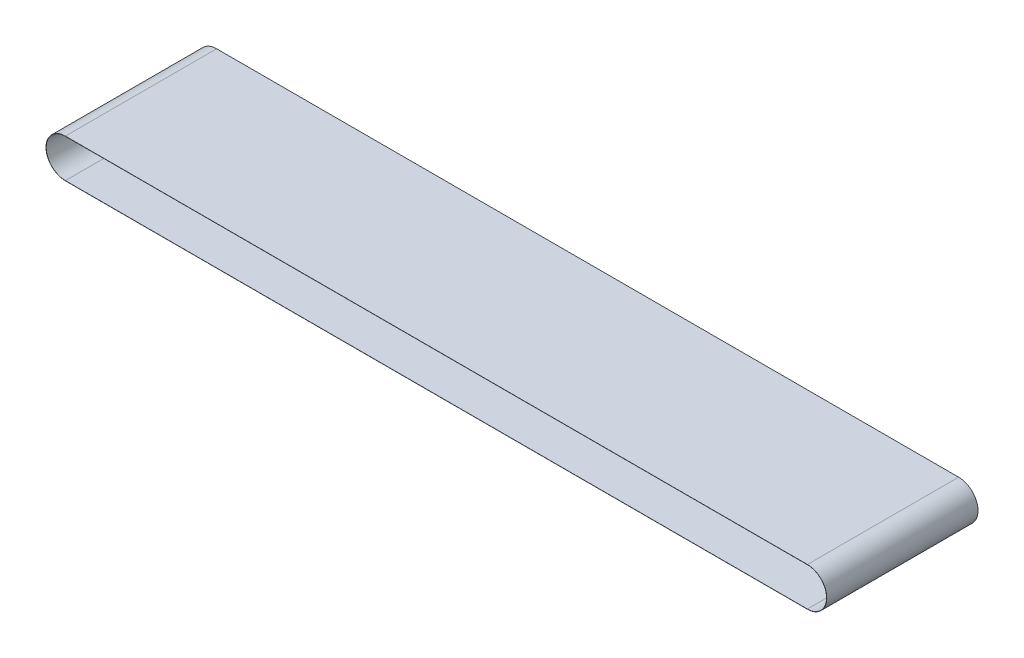
ISO-10303-21;
HEADER;
FILE_DESCRIPTION(('STEP AP214'),'2;1');
FILE_NAME('part.step','',(''),(''),'','','');
FILE_SCHEMA(('AUTOMOTIVE_DESIGN { 1 0 10303 214 1 1 1 1 }'));
ENDSEC;
DATA;
#1=APPLICATION_CONTEXT('core data for automotive mechanical design processes');
#2=APPLICATION_PROTOCOL_DEFINITION('international standard','automotive_design',2000,#1);
#3=PRODUCT_CONTEXT('',#1,'mechanical');
#4=PRODUCT('Part','Part','',(#3));
#5=PRODUCT_RELATED_PRODUCT_CATEGORY('part','',(#4));
#6=PRODUCT_DEFINITION_FORMATION('','',#4);
#7=PRODUCT_DEFINITION_CONTEXT('part definition',#1,'design');
#8=PRODUCT_DEFINITION('design','',#6,#7);
#9=PRODUCT_DEFINITION_SHAPE('','',#8);
#10=(LENGTH_UNIT() NAMED_UNIT(*) SI_UNIT(.MILLI.,.METRE.));
#11=(NAMED_UNIT(*) PLANE_ANGLE_UNIT() SI_UNIT($,.RADIAN.));
#12=(NAMED_UNIT(*) SI_UNIT($,.STERADIAN.) SOLID_ANGLE_UNIT());
#13=UNCERTAINTY_MEASURE_WITH_UNIT(LENGTH_MEASURE(1.E-05),#10,'distance_accuracy_value','');
#14=(GEOMETRIC_REPRESENTATION_CONTEXT(3) GLOBAL_UNCERTAINTY_ASSIGNED_CONTEXT((#13)) GLOBAL_UNIT_ASSIGNED_CONTEXT((#10,
#11,#12)) REPRESENTATION_CONTEXT('',''));
#15=CARTESIAN_POINT('',(0.,0.,0.));
#16=DIRECTION('',(0.,0.,1.));
#17=DIRECTION('',(1.,0.,0.));
#18=AXIS2_PLACEMENT_3D('',#15,#16,#17);
#19=CARTESIAN_POINT('',(0.,0.,80.));
#20=DIRECTION('',(0.,0.,1.));
#21=DIRECTION('',(1.,0.,0.));
#22=AXIS2_PLACEMENT_3D('',#19,#20,#21);
#23=PLANE('',#22);
#24=CARTESIAN_POINT('',(0.,0.,80.));
#25=DIRECTION('',(0.,0.,1.));
#26=DIRECTION('',(1.,0.,0.));
#27=AXIS2_PLACEMENT_3D('',#24,#25,#26);
#28=CIRCLE('',#27,10.25);
#29=CARTESIAN_POINT('',(0.,10.25,80.));
#30=VERTEX_POINT('',#29);
#31=CARTESIAN_POINT('',(0.,-10.25,80.));
#32=VERTEX_POINT('',#31);
#33=EDGE_CURVE('E143',#30,#32,#28,.T.);
#34=ORIENTED_EDGE('',*,*,#33,.T.);
#35=DIRECTION('',(1.,0.,0.));
#36=VECTOR('',#35,1.);
#37=CARTESIAN_POINT('',(0.,-10.25,80.));
#38=LINE('',#37,#36);
#39=CARTESIAN_POINT('',(392.5,-10.25,80.));
#40=VERTEX_POINT('',#39);
#41=EDGE_CURVE('E146',#32,#40,#38,.T.);
#42=ORIENTED_EDGE('',*,*,#41,.T.);
#43=CARTESIAN_POINT('',(392.5,0.,80.));
#44=DIRECTION('',(0.,0.,1.));
#45=DIRECTION('',(1.,0.,0.));
#46=AXIS2_PLACEMENT_3D('',#43,#44,#45);
#47=CIRCLE('',#46,10.25);
#48=CARTESIAN_POINT('',(392.5,10.25,80.));
#49=VERTEX_POINT('',#48);
#50=EDGE_CURVE('E149',#40,#49,#47,.T.);
#51=ORIENTED_EDGE('',*,*,#50,.T.);
#52=DIRECTION('',(-1.,0.,0.));
#53=VECTOR('',#52,1.);
#54=CARTESIAN_POINT('',(0.,10.25,80.));
#55=LINE('',#54,#53);
#56=EDGE_CURVE('E151',#49,#30,#55,.T.);
#57=ORIENTED_EDGE('',*,*,#56,.T.);
#58=EDGE_LOOP('',(#34,#42,#51,#57));
#59=FACE_BOUND('',#58,.T.);
#60=DIRECTION('',(1.,0.,0.));
#61=VECTOR('',#60,1.);
#62=CARTESIAN_POINT('',(0.,-10.15,80.));
#63=LINE('',#62,#61);
#64=CARTESIAN_POINT('',(0.,-10.15,80.));
#65=VERTEX_POINT('',#64);
#66=CARTESIAN_POINT('',(392.5,-10.15,80.));
#67=VERTEX_POINT('',#66);
#68=EDGE_CURVE('E115',#65,#67,#63,.T.);
#69=ORIENTED_EDGE('',*,*,#68,.F.);
#70=CARTESIAN_POINT('',(0.,0.,80.));
#71=DIRECTION('',(0.,0.,1.));
#72=DIRECTION('',(1.,0.,0.));
#73=AXIS2_PLACEMENT_3D('',#70,#71,#72);
#74=CIRCLE('',#73,10.15);
#75=CARTESIAN_POINT('',(0.,10.15,80.));
#76=VERTEX_POINT('',#75);
#77=EDGE_CURVE('E107',#76,#65,#74,.T.);
#78=ORIENTED_EDGE('',*,*,#77,.F.);
#79=DIRECTION('',(-1.,0.,0.));
#80=VECTOR('',#79,1.);
#81=CARTESIAN_POINT('',(0.,10.15,80.));
#82=LINE('',#81,#80);
#83=CARTESIAN_POINT('',(392.5,10.15,80.));
#84=VERTEX_POINT('',#83);
#85=EDGE_CURVE('E129',#84,#76,#82,.T.);
#86=ORIENTED_EDGE('',*,*,#85,.F.);
#87=CARTESIAN_POINT('',(392.5,0.,80.));
#88=DIRECTION('',(0.,0.,1.));
#89=DIRECTION('',(1.,0.,0.));
#90=AXIS2_PLACEMENT_3D('',#87,#88,#89);
#91=CIRCLE('',#90,10.15);
#92=EDGE_CURVE('E127',#67,#84,#91,.T.);
#93=ORIENTED_EDGE('',*,*,#92,.F.);
#94=EDGE_LOOP('',(#69,#78,#86,#93));
#95=FACE_BOUND('',#94,.T.);
#96=ADVANCED_FACE('F42',(#59,#95),#23,.T.);
#97=CARTESIAN_POINT('',(0.,0.,0.));
#98=DIRECTION('',(0.,0.,1.));
#99=DIRECTION('',(1.,0.,0.));
#100=AXIS2_PLACEMENT_3D('',#97,#98,#99);
#101=PLANE('',#100);
#102=CARTESIAN_POINT('',(0.,0.,0.));
#103=DIRECTION('',(0.,0.,1.));
#104=DIRECTION('',(1.,0.,0.));
#105=AXIS2_PLACEMENT_3D('',#102,#103,#104);
#106=CIRCLE('',#105,10.25);
#107=CARTESIAN_POINT('',(0.,10.25,0.));
#108=VERTEX_POINT('',#107);
#109=CARTESIAN_POINT('',(0.,-10.25,0.));
#110=VERTEX_POINT('',#109);
#111=EDGE_CURVE('E123',#108,#110,#106,.T.);
#112=ORIENTED_EDGE('',*,*,#111,.F.);
#113=DIRECTION('',(-1.,0.,0.));
#114=VECTOR('',#113,1.);
#115=CARTESIAN_POINT('',(0.,10.25,0.));
#116=LINE('',#115,#114);
#117=CARTESIAN_POINT('',(392.5,10.25,0.));
#118=VERTEX_POINT('',#117);
#119=EDGE_CURVE('E147',#118,#108,#116,.T.);
#120=ORIENTED_EDGE('',*,*,#119,.F.);
#121=CARTESIAN_POINT('',(392.5,0.,0.));
#122=DIRECTION('',(0.,0.,1.));
#123=DIRECTION('',(1.,0.,0.));
#124=AXIS2_PLACEMENT_3D('',#121,#122,#123);
#125=CIRCLE('',#124,10.25);
#126=CARTESIAN_POINT('',(392.5,-10.25,0.));
#127=VERTEX_POINT('',#126);
#128=EDGE_CURVE('E158',#127,#118,#125,.T.);
#129=ORIENTED_EDGE('',*,*,#128,.F.);
#130=DIRECTION('',(1.,0.,0.));
#131=VECTOR('',#130,1.);
#132=CARTESIAN_POINT('',(0.,-10.25,0.));
#133=LINE('',#132,#131);
#134=EDGE_CURVE('E156',#110,#127,#133,.T.);
#135=ORIENTED_EDGE('',*,*,#134,.F.);
#136=EDGE_LOOP('',(#112,#120,#129,#135));
#137=FACE_BOUND('',#136,.T.);
#138=CARTESIAN_POINT('',(0.,0.,0.));
#139=DIRECTION('',(0.,0.,1.));
#140=DIRECTION('',(1.,0.,0.));
#141=AXIS2_PLACEMENT_3D('',#138,#139,#140);
#142=CIRCLE('',#141,10.15);
#143=CARTESIAN_POINT('',(0.,10.15,0.));
#144=VERTEX_POINT('',#143);
#145=CARTESIAN_POINT('',(0.,-10.15,0.));
#146=VERTEX_POINT('',#145);
#147=EDGE_CURVE('E65',#144,#146,#142,.T.);
#148=ORIENTED_EDGE('',*,*,#147,.T.);
#149=DIRECTION('',(1.,0.,0.));
#150=VECTOR('',#149,1.);
#151=CARTESIAN_POINT('',(0.,-10.15,0.));
#152=LINE('',#151,#150);
#153=CARTESIAN_POINT('',(392.5,-10.15,0.));
#154=VERTEX_POINT('',#153);
#155=EDGE_CURVE('E122',#146,#154,#152,.T.);
#156=ORIENTED_EDGE('',*,*,#155,.T.);
#157=CARTESIAN_POINT('',(392.5,0.,0.));
#158=DIRECTION('',(0.,0.,1.));
#159=DIRECTION('',(1.,0.,0.));
#160=AXIS2_PLACEMENT_3D('',#157,#158,#159);
#161=CIRCLE('',#160,10.15);
#162=CARTESIAN_POINT('',(392.5,10.15,0.));
#163=VERTEX_POINT('',#162);
#164=EDGE_CURVE('E135',#154,#163,#161,.T.);
#165=ORIENTED_EDGE('',*,*,#164,.T.);
#166=DIRECTION('',(-1.,0.,0.));
#167=VECTOR('',#166,1.);
#168=CARTESIAN_POINT('',(0.,10.15,0.));
#169=LINE('',#168,#167);
#170=EDGE_CURVE('E116',#163,#144,#169,.T.);
#171=ORIENTED_EDGE('',*,*,#170,.T.);
#172=EDGE_LOOP('',(#148,#156,#165,#171));
#173=FACE_BOUND('',#172,.T.);
#174=ADVANCED_FACE('F176',(#137,#173),#101,.F.);
#175=CARTESIAN_POINT('',(0.,0.,80.));
#176=DIRECTION('',(0.,0.,-1.));
#177=DIRECTION('',(-1.,0.,0.));
#178=AXIS2_PLACEMENT_3D('',#175,#176,#177);
#179=CYLINDRICAL_SURFACE('',#178,10.25);
#180=ORIENTED_EDGE('',*,*,#111,.T.);
#181=DIRECTION('',(0.,0.,-1.));
#182=VECTOR('',#181,1.);
#183=CARTESIAN_POINT('',(0.,-10.25,80.));
#184=LINE('',#183,#182);
#185=EDGE_CURVE('E11',#32,#110,#184,.T.);
#186=ORIENTED_EDGE('',*,*,#185,.F.);
#187=ORIENTED_EDGE('',*,*,#33,.F.);
#188=DIRECTION('',(0.,0.,-1.));
#189=VECTOR('',#188,1.);
#190=CARTESIAN_POINT('',(0.,10.25,80.));
#191=LINE('',#190,#189);
#192=EDGE_CURVE('E153',#30,#108,#191,.T.);
#193=ORIENTED_EDGE('',*,*,#192,.T.);
#194=EDGE_LOOP('',(#180,#186,#187,#193));
#195=FACE_BOUND('',#194,.T.);
#196=ADVANCED_FACE('F44',(#195),#179,.T.);
#197=CARTESIAN_POINT('',(0.,-10.25,80.));
#198=DIRECTION('',(0.,1.,0.));
#199=DIRECTION('',(0.,0.,1.));
#200=AXIS2_PLACEMENT_3D('',#197,#198,#199);
#201=PLANE('',#200);
#202=ORIENTED_EDGE('',*,*,#134,.T.);
#203=DIRECTION('',(0.,0.,-1.));
#204=VECTOR('',#203,1.);
#205=CARTESIAN_POINT('',(392.5,-10.25,80.));
#206=LINE('',#205,#204);
#207=EDGE_CURVE('E50',#40,#127,#206,.T.);
#208=ORIENTED_EDGE('',*,*,#207,.F.);
#209=ORIENTED_EDGE('',*,*,#41,.F.);
#210=ORIENTED_EDGE('',*,*,#185,.T.);
#211=EDGE_LOOP('',(#202,#208,#209,#210));
#212=FACE_BOUND('',#211,.T.);
#213=ADVANCED_FACE('F186',(#212),#201,.F.);
#214=CARTESIAN_POINT('',(392.5,0.,80.));
#215=DIRECTION('',(0.,0.,-1.));
#216=DIRECTION('',(-1.,0.,0.));
#217=AXIS2_PLACEMENT_3D('',#214,#215,#216);
#218=CYLINDRICAL_SURFACE('',#217,10.25);
#219=ORIENTED_EDGE('',*,*,#128,.T.);
#220=DIRECTION('',(0.,0.,-1.));
#221=VECTOR('',#220,1.);
#222=CARTESIAN_POINT('',(392.5,10.25,80.));
#223=LINE('',#222,#221);
#224=EDGE_CURVE('E163',#49,#118,#223,.T.);
#225=ORIENTED_EDGE('',*,*,#224,.F.);
#226=ORIENTED_EDGE('',*,*,#50,.F.);
#227=ORIENTED_EDGE('',*,*,#207,.T.);
#228=EDGE_LOOP('',(#219,#225,#226,#227));
#229=FACE_BOUND('',#228,.T.);
#230=ADVANCED_FACE('F170',(#229),#218,.T.);
#231=CARTESIAN_POINT('',(0.,10.25,80.));
#232=DIRECTION('',(0.,-1.,0.));
#233=DIRECTION('',(0.,0.,-1.));
#234=AXIS2_PLACEMENT_3D('',#231,#232,#233);
#235=PLANE('',#234);
#236=ORIENTED_EDGE('',*,*,#119,.T.);
#237=ORIENTED_EDGE('',*,*,#192,.F.);
#238=ORIENTED_EDGE('',*,*,#56,.F.);
#239=ORIENTED_EDGE('',*,*,#224,.T.);
#240=EDGE_LOOP('',(#236,#237,#238,#239));
#241=FACE_BOUND('',#240,.T.);
#242=ADVANCED_FACE('F180',(#241),#235,.F.);
#243=CARTESIAN_POINT('',(0.,0.,80.));
#244=DIRECTION('',(0.,0.,-1.));
#245=DIRECTION('',(-1.,0.,0.));
#246=AXIS2_PLACEMENT_3D('',#243,#244,#245);
#247=CYLINDRICAL_SURFACE('',#246,10.15);
#248=ORIENTED_EDGE('',*,*,#147,.F.);
#249=DIRECTION('',(0.,0.,-1.));
#250=VECTOR('',#249,1.);
#251=CARTESIAN_POINT('',(0.,10.15,80.));
#252=LINE('',#251,#250);
#253=EDGE_CURVE('E111',#76,#144,#252,.T.);
#254=ORIENTED_EDGE('',*,*,#253,.F.);
#255=ORIENTED_EDGE('',*,*,#77,.T.);
#256=DIRECTION('',(0.,0.,-1.));
#257=VECTOR('',#256,1.);
#258=CARTESIAN_POINT('',(0.,-10.15,80.));
#259=LINE('',#258,#257);
#260=EDGE_CURVE('E110',#65,#146,#259,.T.);
#261=ORIENTED_EDGE('',*,*,#260,.T.);
#262=EDGE_LOOP('',(#248,#254,#255,#261));
#263=FACE_BOUND('',#262,.T.);
#264=ADVANCED_FACE('F109',(#263),#247,.F.);
#265=CARTESIAN_POINT('',(0.,-10.15,80.));
#266=DIRECTION('',(0.,1.,0.));
#267=DIRECTION('',(0.,0.,1.));
#268=AXIS2_PLACEMENT_3D('',#265,#266,#267);
#269=PLANE('',#268);
#270=ORIENTED_EDGE('',*,*,#155,.F.);
#271=ORIENTED_EDGE('',*,*,#260,.F.);
#272=ORIENTED_EDGE('',*,*,#68,.T.);
#273=DIRECTION('',(0.,0.,-1.));
#274=VECTOR('',#273,1.);
#275=CARTESIAN_POINT('',(392.5,-10.15,80.));
#276=LINE('',#275,#274);
#277=EDGE_CURVE('E124',#67,#154,#276,.T.);
#278=ORIENTED_EDGE('',*,*,#277,.T.);
#279=EDGE_LOOP('',(#270,#271,#272,#278));
#280=FACE_BOUND('',#279,.T.);
#281=ADVANCED_FACE('F119',(#280),#269,.T.);
#282=CARTESIAN_POINT('',(392.5,0.,80.));
#283=DIRECTION('',(0.,0.,-1.));
#284=DIRECTION('',(-1.,0.,0.));
#285=AXIS2_PLACEMENT_3D('',#282,#283,#284);
#286=CYLINDRICAL_SURFACE('',#285,10.15);
#287=ORIENTED_EDGE('',*,*,#164,.F.);
#288=ORIENTED_EDGE('',*,*,#277,.F.);
#289=ORIENTED_EDGE('',*,*,#92,.T.);
#290=DIRECTION('',(0.,0.,-1.));
#291=VECTOR('',#290,1.);
#292=CARTESIAN_POINT('',(392.5,10.15,80.));
#293=LINE('',#292,#291);
#294=EDGE_CURVE('E57',#84,#163,#293,.T.);
#295=ORIENTED_EDGE('',*,*,#294,.T.);
#296=EDGE_LOOP('',(#287,#288,#289,#295));
#297=FACE_BOUND('',#296,.T.);
#298=ADVANCED_FACE('F209',(#297),#286,.F.);
#299=CARTESIAN_POINT('',(0.,10.15,80.));
#300=DIRECTION('',(0.,-1.,0.));
#301=DIRECTION('',(0.,0.,-1.));
#302=AXIS2_PLACEMENT_3D('',#299,#300,#301);
#303=PLANE('',#302);
#304=ORIENTED_EDGE('',*,*,#170,.F.);
#305=ORIENTED_EDGE('',*,*,#294,.F.);
#306=ORIENTED_EDGE('',*,*,#85,.T.);
#307=ORIENTED_EDGE('',*,*,#253,.T.);
#308=EDGE_LOOP('',(#304,#305,#306,#307));
#309=FACE_BOUND('',#308,.T.);
#310=ADVANCED_FACE('F213',(#309),#303,.T.);
#311=CLOSED_SHELL('',(#96,#174,#196,#213,#230,#242,#264,#281,#298,#310));
#312=MANIFOLD_SOLID_BREP('B2',#311);
#313=ADVANCED_BREP_SHAPE_REPRESENTATION('',(#18,#312),#14);
#314=SHAPE_DEFINITION_REPRESENTATION(#9,#313);
ENDSEC;
END-ISO-10303-21;
